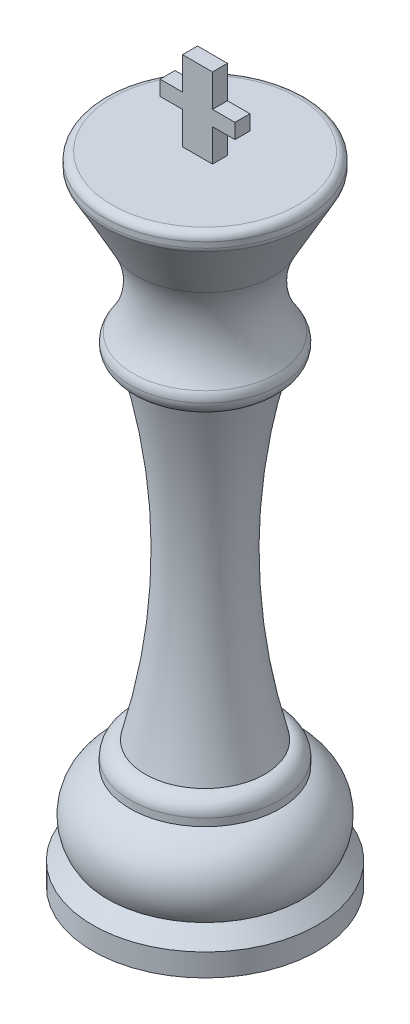
ISO-10303-21;
HEADER;
FILE_DESCRIPTION(('STEP AP214'),'2;1');
FILE_NAME('part.step','',(''),(''),'','','');
FILE_SCHEMA(('AUTOMOTIVE_DESIGN { 1 0 10303 214 1 1 1 1 }'));
ENDSEC;
DATA;
#1=APPLICATION_CONTEXT('core data for automotive mechanical design processes');
#2=APPLICATION_PROTOCOL_DEFINITION('international standard','automotive_design',2000,#1);
#3=PRODUCT_CONTEXT('',#1,'mechanical');
#4=PRODUCT('Part','Part','',(#3));
#5=PRODUCT_RELATED_PRODUCT_CATEGORY('part','',(#4));
#6=PRODUCT_DEFINITION_FORMATION('','',#4);
#7=PRODUCT_DEFINITION_CONTEXT('part definition',#1,'design');
#8=PRODUCT_DEFINITION('design','',#6,#7);
#9=PRODUCT_DEFINITION_SHAPE('','',#8);
#10=(LENGTH_UNIT() NAMED_UNIT(*) SI_UNIT(.MILLI.,.METRE.));
#11=(NAMED_UNIT(*) PLANE_ANGLE_UNIT() SI_UNIT($,.RADIAN.));
#12=(NAMED_UNIT(*) SI_UNIT($,.STERADIAN.) SOLID_ANGLE_UNIT());
#13=UNCERTAINTY_MEASURE_WITH_UNIT(LENGTH_MEASURE(1.E-05),#10,'distance_accuracy_value','');
#14=(GEOMETRIC_REPRESENTATION_CONTEXT(3) GLOBAL_UNCERTAINTY_ASSIGNED_CONTEXT((#13)) GLOBAL_UNIT_ASSIGNED_CONTEXT((#10,
#11,#12)) REPRESENTATION_CONTEXT('',''));
#15=CARTESIAN_POINT('',(0.,0.,0.));
#16=DIRECTION('',(0.,0.,1.));
#17=DIRECTION('',(1.,0.,0.));
#18=AXIS2_PLACEMENT_3D('',#15,#16,#17);
#19=CARTESIAN_POINT('',(0.,0.,0.));
#20=DIRECTION('',(0.,1.,0.));
#21=DIRECTION('',(0.,0.,1.));
#22=AXIS2_PLACEMENT_3D('',#19,#20,#21);
#23=PLANE('',#22);
#24=CARTESIAN_POINT('',(0.,0.,0.));
#25=DIRECTION('',(0.,-1.,0.));
#26=DIRECTION('',(0.,0.,-1.));
#27=AXIS2_PLACEMENT_3D('',#24,#25,#26);
#28=CIRCLE('',#27,15.);
#29=CARTESIAN_POINT('',(0.,0.,-15.));
#30=VERTEX_POINT('',#29);
#31=EDGE_CURVE('E205',#30,#30,#28,.T.);
#32=ORIENTED_EDGE('',*,*,#31,.T.);
#33=EDGE_LOOP('',(#32));
#34=FACE_BOUND('',#33,.T.);
#35=ADVANCED_FACE('F39',(#34),#23,.F.);
#36=CARTESIAN_POINT('',(0.,0.,0.));
#37=DIRECTION('',(0.,-1.,0.));
#38=DIRECTION('',(0.,0.,-1.));
#39=AXIS2_PLACEMENT_3D('',#36,#37,#38);
#40=CYLINDRICAL_SURFACE('',#39,15.);
#41=ORIENTED_EDGE('',*,*,#31,.F.);
#42=EDGE_LOOP('',(#41));
#43=FACE_BOUND('',#42,.T.);
#44=CARTESIAN_POINT('',(0.,3.,0.));
#45=DIRECTION('',(0.,-1.,0.));
#46=DIRECTION('',(0.,0.,-1.));
#47=AXIS2_PLACEMENT_3D('',#44,#45,#46);
#48=CIRCLE('',#47,15.);
#49=CARTESIAN_POINT('',(0.,3.,-15.));
#50=VERTEX_POINT('',#49);
#51=EDGE_CURVE('E201',#50,#50,#48,.T.);
#52=ORIENTED_EDGE('',*,*,#51,.T.);
#53=EDGE_LOOP('',(#52));
#54=FACE_BOUND('',#53,.T.);
#55=ADVANCED_FACE('F226',(#43,#54),#40,.T.);
#56=CARTESIAN_POINT('',(0.,5.,0.));
#57=DIRECTION('',(0.,-1.,0.));
#58=DIRECTION('',(0.,0.,-1.));
#59=AXIS2_PLACEMENT_3D('',#56,#57,#58);
#60=CONICAL_SURFACE('',#59,13.,0.785398163397448);
#61=ORIENTED_EDGE('',*,*,#51,.F.);
#62=EDGE_LOOP('',(#61));
#63=FACE_BOUND('',#62,.T.);
#64=CARTESIAN_POINT('',(0.,5.,0.));
#65=DIRECTION('',(0.,-1.,0.));
#66=DIRECTION('',(0.,0.,-1.));
#67=AXIS2_PLACEMENT_3D('',#64,#65,#66);
#68=CIRCLE('',#67,13.);
#69=CARTESIAN_POINT('',(0.,5.,-13.));
#70=VERTEX_POINT('',#69);
#71=EDGE_CURVE('E197',#70,#70,#68,.T.);
#72=ORIENTED_EDGE('',*,*,#71,.T.);
#73=EDGE_LOOP('',(#72));
#74=FACE_BOUND('',#73,.T.);
#75=ADVANCED_FACE('F231',(#63,#74),#60,.T.);
#76=CARTESIAN_POINT('',(0.,8.31380661428568,0.));
#77=DIRECTION('',(0.,-1.,0.));
#78=DIRECTION('',(0.,0.,-1.));
#79=AXIS2_PLACEMENT_3D('',#76,#77,#78);
#80=TOROIDAL_SURFACE('',#79,7.99813177671418,6.);
#81=ORIENTED_EDGE('',*,*,#71,.F.);
#82=EDGE_LOOP('',(#81));
#83=FACE_BOUND('',#82,.T.);
#84=CARTESIAN_POINT('',(0.,13.97,0.));
#85=DIRECTION('',(0.,-1.,0.));
#86=DIRECTION('',(0.,0.,-1.));
#87=AXIS2_PLACEMENT_3D('',#84,#85,#86);
#88=CIRCLE('',#87,10.);
#89=CARTESIAN_POINT('',(0.,13.97,-10.));
#90=VERTEX_POINT('',#89);
#91=EDGE_CURVE('E193',#90,#90,#88,.T.);
#92=ORIENTED_EDGE('',*,*,#91,.T.);
#93=EDGE_LOOP('',(#92));
#94=FACE_BOUND('',#93,.T.);
#95=ADVANCED_FACE('F237',(#83,#94),#80,.T.);
#96=CARTESIAN_POINT('',(0.,0.,0.));
#97=DIRECTION('',(0.,-1.,0.));
#98=DIRECTION('',(0.,0.,-1.));
#99=AXIS2_PLACEMENT_3D('',#96,#97,#98);
#100=CYLINDRICAL_SURFACE('',#99,10.);
#101=ORIENTED_EDGE('',*,*,#91,.F.);
#102=EDGE_LOOP('',(#101));
#103=FACE_BOUND('',#102,.T.);
#104=CARTESIAN_POINT('',(0.,14.97,0.));
#105=DIRECTION('',(0.,-1.,0.));
#106=DIRECTION('',(0.,0.,-1.));
#107=AXIS2_PLACEMENT_3D('',#104,#105,#106);
#108=CIRCLE('',#107,10.);
#109=CARTESIAN_POINT('',(0.,14.97,-10.));
#110=VERTEX_POINT('',#109);
#111=EDGE_CURVE('E189',#110,#110,#108,.T.);
#112=ORIENTED_EDGE('',*,*,#111,.T.);
#113=EDGE_LOOP('',(#112));
#114=FACE_BOUND('',#113,.T.);
#115=ADVANCED_FACE('F241',(#103,#114),#100,.T.);
#116=CARTESIAN_POINT('',(0.,14.97,0.));
#117=DIRECTION('',(0.,-1.,0.));
#118=DIRECTION('',(0.,0.,-1.));
#119=AXIS2_PLACEMENT_3D('',#116,#117,#118);
#120=TOROIDAL_SURFACE('',#119,8.,2.);
#121=ORIENTED_EDGE('',*,*,#111,.F.);
#122=EDGE_LOOP('',(#121));
#123=FACE_BOUND('',#122,.T.);
#124=CARTESIAN_POINT('',(0.,16.97,0.));
#125=DIRECTION('',(0.,-1.,0.));
#126=DIRECTION('',(0.,0.,-1.));
#127=AXIS2_PLACEMENT_3D('',#124,#125,#126);
#128=CIRCLE('',#127,8.);
#129=CARTESIAN_POINT('',(0.,16.97,-8.));
#130=VERTEX_POINT('',#129);
#131=EDGE_CURVE('E185',#130,#130,#128,.T.);
#132=ORIENTED_EDGE('',*,*,#131,.T.);
#133=EDGE_LOOP('',(#132));
#134=FACE_BOUND('',#133,.T.);
#135=ADVANCED_FACE('F245',(#123,#134),#120,.T.);
#136=CARTESIAN_POINT('',(0.,38.98,0.));
#137=DIRECTION('',(0.,-1.,0.));
#138=DIRECTION('',(0.,0.,-1.));
#139=AXIS2_PLACEMENT_3D('',#136,#137,#138);
#140=TOROIDAL_SURFACE('',#139,90.1009129060085,85.);
#141=ORIENTED_EDGE('',*,*,#131,.F.);
#142=EDGE_LOOP('',(#141));
#143=FACE_BOUND('',#142,.T.);
#144=CARTESIAN_POINT('',(0.,60.99,0.));
#145=DIRECTION('',(0.,-1.,0.));
#146=DIRECTION('',(0.,0.,-1.));
#147=AXIS2_PLACEMENT_3D('',#144,#145,#146);
#148=CIRCLE('',#147,8.00000000000001);
#149=CARTESIAN_POINT('',(0.,60.99,-8.00000000000001));
#150=VERTEX_POINT('',#149);
#151=EDGE_CURVE('E181',#150,#150,#148,.T.);
#152=ORIENTED_EDGE('',*,*,#151,.T.);
#153=EDGE_LOOP('',(#152));
#154=FACE_BOUND('',#153,.T.);
#155=ADVANCED_FACE('F249',(#143,#154),#140,.F.);
#156=CARTESIAN_POINT('',(0.,62.99,0.));
#157=DIRECTION('',(0.,-1.,0.));
#158=DIRECTION('',(0.,0.,-1.));
#159=AXIS2_PLACEMENT_3D('',#156,#157,#158);
#160=TOROIDAL_SURFACE('',#159,8.00000000000001,2.);
#161=ORIENTED_EDGE('',*,*,#151,.F.);
#162=EDGE_LOOP('',(#161));
#163=FACE_BOUND('',#162,.T.);
#164=CARTESIAN_POINT('',(0.,62.99,0.));
#165=DIRECTION('',(0.,-1.,0.));
#166=DIRECTION('',(0.,0.,-1.));
#167=AXIS2_PLACEMENT_3D('',#164,#165,#166);
#168=CIRCLE('',#167,10.);
#169=CARTESIAN_POINT('',(0.,62.99,-10.));
#170=VERTEX_POINT('',#169);
#171=EDGE_CURVE('E177',#170,#170,#168,.T.);
#172=ORIENTED_EDGE('',*,*,#171,.T.);
#173=EDGE_LOOP('',(#172));
#174=FACE_BOUND('',#173,.T.);
#175=ADVANCED_FACE('F253',(#163,#174),#160,.T.);
#176=CARTESIAN_POINT('',(0.,62.99,0.));
#177=DIRECTION('',(0.,-1.,0.));
#178=DIRECTION('',(0.,0.,-1.));
#179=AXIS2_PLACEMENT_3D('',#176,#177,#178);
#180=TOROIDAL_SURFACE('',#179,8.0183666666667,1.98163333333331);
#181=ORIENTED_EDGE('',*,*,#171,.F.);
#182=EDGE_LOOP('',(#181));
#183=FACE_BOUND('',#182,.T.);
#184=CARTESIAN_POINT('',(0.,64.15,0.));
#185=DIRECTION('',(0.,-1.,0.));
#186=DIRECTION('',(0.,0.,-1.));
#187=AXIS2_PLACEMENT_3D('',#184,#185,#186);
#188=CIRCLE('',#187,9.625);
#189=CARTESIAN_POINT('',(0.,64.15,-9.625));
#190=VERTEX_POINT('',#189);
#191=EDGE_CURVE('E173',#190,#190,#188,.T.);
#192=ORIENTED_EDGE('',*,*,#191,.T.);
#193=EDGE_LOOP('',(#192));
#194=FACE_BOUND('',#193,.T.);
#195=ADVANCED_FACE('F257',(#183,#194),#180,.T.);
#196=CARTESIAN_POINT('',(0.,70.0974171138287,0.));
#197=DIRECTION('',(0.,-1.,0.));
#198=DIRECTION('',(0.,0.,-1.));
#199=AXIS2_PLACEMENT_3D('',#196,#197,#198);
#200=TOROIDAL_SURFACE('',#199,17.8623436054433,10.16);
#201=ORIENTED_EDGE('',*,*,#191,.F.);
#202=EDGE_LOOP('',(#201));
#203=FACE_BOUND('',#202,.T.);
#204=CARTESIAN_POINT('',(0.,75.0657635006116,0.));
#205=DIRECTION('',(0.,-1.,0.));
#206=DIRECTION('',(0.,0.,-1.));
#207=AXIS2_PLACEMENT_3D('',#204,#205,#206);
#208=CIRCLE('',#207,9.00000000000001);
#209=CARTESIAN_POINT('',(0.,75.0657635006116,-9.00000000000001));
#210=VERTEX_POINT('',#209);
#211=EDGE_CURVE('E169',#210,#210,#208,.T.);
#212=ORIENTED_EDGE('',*,*,#211,.T.);
#213=EDGE_LOOP('',(#212));
#214=FACE_BOUND('',#213,.T.);
#215=ADVANCED_FACE('F261',(#203,#214),#200,.F.);
#216=CARTESIAN_POINT('',(0.,82.8397501905373,0.));
#217=DIRECTION('',(0.,1.,0.));
#218=DIRECTION('',(0.,0.,1.));
#219=AXIS2_PLACEMENT_3D('',#216,#217,#218);
#220=CONICAL_SURFACE('',#219,13.3038716011996,0.505621884302758);
#221=ORIENTED_EDGE('',*,*,#211,.F.);
#222=EDGE_LOOP('',(#221));
#223=FACE_BOUND('',#222,.T.);
#224=CARTESIAN_POINT('',(0.,82.8397501905373,0.));
#225=DIRECTION('',(0.,-1.,0.));
#226=DIRECTION('',(0.,0.,-1.));
#227=AXIS2_PLACEMENT_3D('',#224,#225,#226);
#228=CIRCLE('',#227,13.3038716011996);
#229=CARTESIAN_POINT('',(0.,82.8397501905373,-13.3038716011996));
#230=VERTEX_POINT('',#229);
#231=EDGE_CURVE('E160',#230,#230,#228,.T.);
#232=ORIENTED_EDGE('',*,*,#231,.T.);
#233=EDGE_LOOP('',(#232));
#234=FACE_BOUND('',#233,.T.);
#235=ADVANCED_FACE('F265',(#223,#234),#220,.T.);
#236=CARTESIAN_POINT('',(0.,83.3241017945401,0.));
#237=DIRECTION('',(0.,-1.,0.));
#238=DIRECTION('',(0.,0.,-1.));
#239=AXIS2_PLACEMENT_3D('',#236,#237,#238);
#240=TOROIDAL_SURFACE('',#239,12.4289981682393,0.999999999999999);
#241=ORIENTED_EDGE('',*,*,#231,.F.);
#242=EDGE_LOOP('',(#241));
#243=FACE_BOUND('',#242,.T.);
#244=CARTESIAN_POINT('',(0.,83.3241017945401,0.));
#245=DIRECTION('',(0.,-1.,0.));
#246=DIRECTION('',(0.,0.,-1.));
#247=AXIS2_PLACEMENT_3D('',#244,#245,#246);
#248=CIRCLE('',#247,13.4289981682393);
#249=CARTESIAN_POINT('',(0.,83.3241017945401,-13.4289981682393));
#250=VERTEX_POINT('',#249);
#251=EDGE_CURVE('E155',#250,#250,#248,.T.);
#252=ORIENTED_EDGE('',*,*,#251,.T.);
#253=EDGE_LOOP('',(#252));
#254=FACE_BOUND('',#253,.T.);
#255=ADVANCED_FACE('F269',(#243,#254),#240,.T.);
#256=CARTESIAN_POINT('',(0.,0.,0.));
#257=DIRECTION('',(0.,-1.,0.));
#258=DIRECTION('',(0.,0.,-1.));
#259=AXIS2_PLACEMENT_3D('',#256,#257,#258);
#260=CYLINDRICAL_SURFACE('',#259,13.4289981682393);
#261=CARTESIAN_POINT('',(0.,84.0657635006117,0.));
#262=DIRECTION('',(0.,-1.,0.));
#263=DIRECTION('',(0.,0.,-1.));
#264=AXIS2_PLACEMENT_3D('',#261,#262,#263);
#265=CIRCLE('',#264,13.4289981682393);
#266=CARTESIAN_POINT('',(0.,84.0657635006117,-13.4289981682393));
#267=VERTEX_POINT('',#266);
#268=EDGE_CURVE('E48',#267,#267,#265,.T.);
#269=ORIENTED_EDGE('',*,*,#268,.T.);
#270=EDGE_LOOP('',(#269));
#271=FACE_BOUND('',#270,.T.);
#272=ORIENTED_EDGE('',*,*,#251,.F.);
#273=EDGE_LOOP('',(#272));
#274=FACE_BOUND('',#273,.T.);
#275=ADVANCED_FACE('F212',(#271,#274),#260,.T.);
#276=CARTESIAN_POINT('',(-13.4289981682393,85.0657635006117,0.));
#277=DIRECTION('',(0.,-1.,0.));
#278=DIRECTION('',(0.,0.,-1.));
#279=AXIS2_PLACEMENT_3D('',#276,#277,#278);
#280=PLANE('',#279);
#281=DIRECTION('',(0.,0.,-1.));
#282=VECTOR('',#281,1.);
#283=CARTESIAN_POINT('',(1.99100183176075,85.0657635006117,1.));
#284=LINE('',#283,#282);
#285=CARTESIAN_POINT('',(1.99100183176075,85.0657635006117,1.));
#286=VERTEX_POINT('',#285);
#287=CARTESIAN_POINT('',(1.99100183176075,85.0657635006117,-1.));
#288=VERTEX_POINT('',#287);
#289=EDGE_CURVE('E60',#286,#288,#284,.T.);
#290=ORIENTED_EDGE('',*,*,#289,.F.);
#291=DIRECTION('',(1.,0.,0.));
#292=VECTOR('',#291,1.);
#293=CARTESIAN_POINT('',(-2.00899816823925,85.0657635006117,1.));
#294=LINE('',#293,#292);
#295=CARTESIAN_POINT('',(-2.00899816823925,85.0657635006117,1.));
#296=VERTEX_POINT('',#295);
#297=EDGE_CURVE('E55',#296,#286,#294,.T.);
#298=ORIENTED_EDGE('',*,*,#297,.F.);
#299=DIRECTION('',(0.,0.,-1.));
#300=VECTOR('',#299,1.);
#301=CARTESIAN_POINT('',(-2.00899816823925,85.0657635006117,1.));
#302=LINE('',#301,#300);
#303=CARTESIAN_POINT('',(-2.00899816823925,85.0657635006117,-1.));
#304=VERTEX_POINT('',#303);
#305=EDGE_CURVE('E541',#296,#304,#302,.T.);
#306=ORIENTED_EDGE('',*,*,#305,.T.);
#307=DIRECTION('',(1.,0.,0.));
#308=VECTOR('',#307,1.);
#309=CARTESIAN_POINT('',(-2.00899816823925,85.0657635006117,-1.));
#310=LINE('',#309,#308);
#311=EDGE_CURVE('E510',#304,#288,#310,.T.);
#312=ORIENTED_EDGE('',*,*,#311,.T.);
#313=EDGE_LOOP('',(#290,#298,#306,#312));
#314=FACE_BOUND('',#313,.T.);
#315=CARTESIAN_POINT('',(0.,85.0657635006117,0.));
#316=DIRECTION('',(0.,-1.,0.));
#317=DIRECTION('',(0.,0.,-1.));
#318=AXIS2_PLACEMENT_3D('',#315,#316,#317);
#319=CIRCLE('',#318,12.4289981682393);
#320=CARTESIAN_POINT('',(0.,85.0657635006117,-12.4289981682393));
#321=VERTEX_POINT('',#320);
#322=EDGE_CURVE('E11',#321,#321,#319,.F.);
#323=ORIENTED_EDGE('',*,*,#322,.T.);
#324=EDGE_LOOP('',(#323));
#325=FACE_BOUND('',#324,.T.);
#326=ADVANCED_FACE('F216',(#314,#325),#280,.F.);
#327=CARTESIAN_POINT('',(0.,84.0657635006117,0.));
#328=DIRECTION('',(0.,-1.,0.));
#329=DIRECTION('',(0.,0.,-1.));
#330=AXIS2_PLACEMENT_3D('',#327,#328,#329);
#331=TOROIDAL_SURFACE('',#330,12.4289981682393,1.);
#332=ORIENTED_EDGE('',*,*,#322,.F.);
#333=EDGE_LOOP('',(#332));
#334=FACE_BOUND('',#333,.T.);
#335=ORIENTED_EDGE('',*,*,#268,.F.);
#336=EDGE_LOOP('',(#335));
#337=FACE_BOUND('',#336,.T.);
#338=ADVANCED_FACE('F41',(#334,#337),#331,.T.);
#339=CARTESIAN_POINT('',(1.99100183176075,91.4020353946953,1.));
#340=DIRECTION('',(-1.,0.,0.));
#341=DIRECTION('',(0.,0.,1.));
#342=AXIS2_PLACEMENT_3D('',#339,#340,#341);
#343=PLANE('',#342);
#344=DIRECTION('',(0.,1.,0.));
#345=VECTOR('',#344,1.);
#346=CARTESIAN_POINT('',(1.99100183176075,91.4020353946953,-1.));
#347=LINE('',#346,#345);
#348=CARTESIAN_POINT('',(1.99100183176075,91.4020353946953,-1.));
#349=VERTEX_POINT('',#348);
#350=CARTESIAN_POINT('',(1.99100183176075,95.7383072887789,-1.));
#351=VERTEX_POINT('',#350);
#352=EDGE_CURVE('E153',#349,#351,#347,.T.);
#353=ORIENTED_EDGE('',*,*,#352,.T.);
#354=DIRECTION('',(0.,0.,-1.));
#355=VECTOR('',#354,1.);
#356=CARTESIAN_POINT('',(1.99100183176075,95.7383072887789,1.));
#357=LINE('',#356,#355);
#358=CARTESIAN_POINT('',(1.99100183176075,95.7383072887789,1.));
#359=VERTEX_POINT('',#358);
#360=EDGE_CURVE('E131',#359,#351,#357,.T.);
#361=ORIENTED_EDGE('',*,*,#360,.F.);
#362=DIRECTION('',(0.,1.,0.));
#363=VECTOR('',#362,1.);
#364=CARTESIAN_POINT('',(1.99100183176075,91.4020353946953,1.));
#365=LINE('',#364,#363);
#366=CARTESIAN_POINT('',(1.99100183176075,91.4020353946953,1.));
#367=VERTEX_POINT('',#366);
#368=EDGE_CURVE('E139',#367,#359,#365,.T.);
#369=ORIENTED_EDGE('',*,*,#368,.F.);
#370=DIRECTION('',(0.,0.,-1.));
#371=VECTOR('',#370,1.);
#372=CARTESIAN_POINT('',(1.99100183176075,91.4020353946953,1.));
#373=LINE('',#372,#371);
#374=EDGE_CURVE('E524',#367,#349,#373,.T.);
#375=ORIENTED_EDGE('',*,*,#374,.T.);
#376=EDGE_LOOP('',(#353,#361,#369,#375));
#377=FACE_BOUND('',#376,.T.);
#378=ADVANCED_FACE('F151',(#377),#343,.F.);
#379=CARTESIAN_POINT('',(1.99100183176075,95.7383072887789,1.));
#380=DIRECTION('',(0.,-1.,0.));
#381=DIRECTION('',(0.,0.,-1.));
#382=AXIS2_PLACEMENT_3D('',#379,#380,#381);
#383=PLANE('',#382);
#384=DIRECTION('',(-1.,0.,0.));
#385=VECTOR('',#384,1.);
#386=CARTESIAN_POINT('',(1.99100183176075,95.7383072887789,-1.));
#387=LINE('',#386,#385);
#388=CARTESIAN_POINT('',(-2.00899816823925,95.7383072887789,-1.));
#389=VERTEX_POINT('',#388);
#390=EDGE_CURVE('E486',#351,#389,#387,.T.);
#391=ORIENTED_EDGE('',*,*,#390,.T.);
#392=DIRECTION('',(0.,0.,-1.));
#393=VECTOR('',#392,1.);
#394=CARTESIAN_POINT('',(-2.00899816823925,95.7383072887789,1.));
#395=LINE('',#394,#393);
#396=CARTESIAN_POINT('',(-2.00899816823925,95.7383072887789,1.));
#397=VERTEX_POINT('',#396);
#398=EDGE_CURVE('E134',#397,#389,#395,.T.);
#399=ORIENTED_EDGE('',*,*,#398,.F.);
#400=DIRECTION('',(-1.,0.,0.));
#401=VECTOR('',#400,1.);
#402=CARTESIAN_POINT('',(1.99100183176075,95.7383072887789,1.));
#403=LINE('',#402,#401);
#404=EDGE_CURVE('E127',#359,#397,#403,.T.);
#405=ORIENTED_EDGE('',*,*,#404,.F.);
#406=ORIENTED_EDGE('',*,*,#360,.T.);
#407=EDGE_LOOP('',(#391,#399,#405,#406));
#408=FACE_BOUND('',#407,.T.);
#409=ADVANCED_FACE('F129',(#408),#383,.F.);
#410=CARTESIAN_POINT('',(-2.00899816823925,95.7383072887789,1.));
#411=DIRECTION('',(1.,0.,0.));
#412=DIRECTION('',(0.,1.,0.));
#413=AXIS2_PLACEMENT_3D('',#410,#411,#412);
#414=PLANE('',#413);
#415=DIRECTION('',(0.,-1.,0.));
#416=VECTOR('',#415,1.);
#417=CARTESIAN_POINT('',(-2.00899816823925,95.7383072887789,-1.));
#418=LINE('',#417,#416);
#419=CARTESIAN_POINT('',(-2.00899816823925,91.4020353946953,-1.));
#420=VERTEX_POINT('',#419);
#421=EDGE_CURVE('E490',#389,#420,#418,.T.);
#422=ORIENTED_EDGE('',*,*,#421,.T.);
#423=DIRECTION('',(0.,0.,-1.));
#424=VECTOR('',#423,1.);
#425=CARTESIAN_POINT('',(-2.00899816823925,91.4020353946953,1.));
#426=LINE('',#425,#424);
#427=CARTESIAN_POINT('',(-2.00899816823925,91.4020353946953,1.));
#428=VERTEX_POINT('',#427);
#429=EDGE_CURVE('E162',#428,#420,#426,.T.);
#430=ORIENTED_EDGE('',*,*,#429,.F.);
#431=DIRECTION('',(0.,-1.,0.));
#432=VECTOR('',#431,1.);
#433=CARTESIAN_POINT('',(-2.00899816823925,95.7383072887789,1.));
#434=LINE('',#433,#432);
#435=EDGE_CURVE('E138',#397,#428,#434,.T.);
#436=ORIENTED_EDGE('',*,*,#435,.F.);
#437=ORIENTED_EDGE('',*,*,#398,.T.);
#438=EDGE_LOOP('',(#422,#430,#436,#437));
#439=FACE_BOUND('',#438,.T.);
#440=ADVANCED_FACE('F278',(#439),#414,.F.);
#441=CARTESIAN_POINT('',(-2.00899816823925,91.4020353946953,1.));
#442=DIRECTION('',(0.,-1.,0.));
#443=DIRECTION('',(0.,0.,-1.));
#444=AXIS2_PLACEMENT_3D('',#441,#442,#443);
#445=PLANE('',#444);
#446=DIRECTION('',(-1.,0.,0.));
#447=VECTOR('',#446,1.);
#448=CARTESIAN_POINT('',(-2.00899816823925,91.4020353946953,-1.));
#449=LINE('',#448,#447);
#450=CARTESIAN_POINT('',(-5.00899816823925,91.4020353946953,-1.));
#451=VERTEX_POINT('',#450);
#452=EDGE_CURVE('E497',#420,#451,#449,.T.);
#453=ORIENTED_EDGE('',*,*,#452,.T.);
#454=DIRECTION('',(0.,0.,-1.));
#455=VECTOR('',#454,1.);
#456=CARTESIAN_POINT('',(-5.00899816823925,91.4020353946953,1.));
#457=LINE('',#456,#455);
#458=CARTESIAN_POINT('',(-5.00899816823925,91.4020353946953,1.));
#459=VERTEX_POINT('',#458);
#460=EDGE_CURVE('E552',#459,#451,#457,.T.);
#461=ORIENTED_EDGE('',*,*,#460,.F.);
#462=DIRECTION('',(-1.,0.,0.));
#463=VECTOR('',#462,1.);
#464=CARTESIAN_POINT('',(-2.00899816823925,91.4020353946953,1.));
#465=LINE('',#464,#463);
#466=EDGE_CURVE('E561',#428,#459,#465,.T.);
#467=ORIENTED_EDGE('',*,*,#466,.F.);
#468=ORIENTED_EDGE('',*,*,#429,.T.);
#469=EDGE_LOOP('',(#453,#461,#467,#468));
#470=FACE_BOUND('',#469,.T.);
#471=ADVANCED_FACE('F281',(#470),#445,.F.);
#472=CARTESIAN_POINT('',(-5.00899816823925,91.4020353946953,1.));
#473=DIRECTION('',(1.,0.,0.));
#474=DIRECTION('',(0.,0.,-1.));
#475=AXIS2_PLACEMENT_3D('',#472,#473,#474);
#476=PLANE('',#475);
#477=DIRECTION('',(0.,-1.,0.));
#478=VECTOR('',#477,1.);
#479=CARTESIAN_POINT('',(-5.00899816823925,91.4020353946953,-1.));
#480=LINE('',#479,#478);
#481=CARTESIAN_POINT('',(-5.00899816823925,89.4020353946953,-1.));
#482=VERTEX_POINT('',#481);
#483=EDGE_CURVE('E500',#451,#482,#480,.T.);
#484=ORIENTED_EDGE('',*,*,#483,.T.);
#485=DIRECTION('',(0.,0.,-1.));
#486=VECTOR('',#485,1.);
#487=CARTESIAN_POINT('',(-5.00899816823925,89.4020353946953,1.));
#488=LINE('',#487,#486);
#489=CARTESIAN_POINT('',(-5.00899816823925,89.4020353946953,1.));
#490=VERTEX_POINT('',#489);
#491=EDGE_CURVE('E548',#490,#482,#488,.T.);
#492=ORIENTED_EDGE('',*,*,#491,.F.);
#493=DIRECTION('',(0.,-1.,0.));
#494=VECTOR('',#493,1.);
#495=CARTESIAN_POINT('',(-5.00899816823925,91.4020353946953,1.));
#496=LINE('',#495,#494);
#497=EDGE_CURVE('E573',#459,#490,#496,.T.);
#498=ORIENTED_EDGE('',*,*,#497,.F.);
#499=ORIENTED_EDGE('',*,*,#460,.T.);
#500=EDGE_LOOP('',(#484,#492,#498,#499));
#501=FACE_BOUND('',#500,.T.);
#502=ADVANCED_FACE('F285',(#501),#476,.F.);
#503=CARTESIAN_POINT('',(-5.00899816823925,89.4020353946953,1.));
#504=DIRECTION('',(0.,1.,0.));
#505=DIRECTION('',(0.,0.,1.));
#506=AXIS2_PLACEMENT_3D('',#503,#504,#505);
#507=PLANE('',#506);
#508=DIRECTION('',(1.,0.,0.));
#509=VECTOR('',#508,1.);
#510=CARTESIAN_POINT('',(-5.00899816823925,89.4020353946953,-1.));
#511=LINE('',#510,#509);
#512=CARTESIAN_POINT('',(-2.00899816823925,89.4020353946953,-1.));
#513=VERTEX_POINT('',#512);
#514=EDGE_CURVE('E503',#482,#513,#511,.T.);
#515=ORIENTED_EDGE('',*,*,#514,.T.);
#516=DIRECTION('',(0.,0.,-1.));
#517=VECTOR('',#516,1.);
#518=CARTESIAN_POINT('',(-2.00899816823925,89.4020353946953,1.));
#519=LINE('',#518,#517);
#520=CARTESIAN_POINT('',(-2.00899816823925,89.4020353946953,1.));
#521=VERTEX_POINT('',#520);
#522=EDGE_CURVE('E544',#521,#513,#519,.T.);
#523=ORIENTED_EDGE('',*,*,#522,.F.);
#524=DIRECTION('',(1.,0.,0.));
#525=VECTOR('',#524,1.);
#526=CARTESIAN_POINT('',(-5.00899816823925,89.4020353946953,1.));
#527=LINE('',#526,#525);
#528=EDGE_CURVE('E569',#490,#521,#527,.T.);
#529=ORIENTED_EDGE('',*,*,#528,.F.);
#530=ORIENTED_EDGE('',*,*,#491,.T.);
#531=EDGE_LOOP('',(#515,#523,#529,#530));
#532=FACE_BOUND('',#531,.T.);
#533=ADVANCED_FACE('F289',(#532),#507,.F.);
#534=CARTESIAN_POINT('',(-2.00899816823925,89.4020353946953,1.));
#535=DIRECTION('',(1.,0.,0.));
#536=DIRECTION('',(0.,1.,0.));
#537=AXIS2_PLACEMENT_3D('',#534,#535,#536);
#538=PLANE('',#537);
#539=DIRECTION('',(0.,-1.,0.));
#540=VECTOR('',#539,1.);
#541=CARTESIAN_POINT('',(-2.00899816823925,89.4020353946953,-1.));
#542=LINE('',#541,#540);
#543=EDGE_CURVE('E506',#513,#304,#542,.T.);
#544=ORIENTED_EDGE('',*,*,#543,.T.);
#545=ORIENTED_EDGE('',*,*,#305,.F.);
#546=DIRECTION('',(0.,-1.,0.));
#547=VECTOR('',#546,1.);
#548=CARTESIAN_POINT('',(-2.00899816823925,89.4020353946953,1.));
#549=LINE('',#548,#547);
#550=EDGE_CURVE('E572',#521,#296,#549,.T.);
#551=ORIENTED_EDGE('',*,*,#550,.F.);
#552=ORIENTED_EDGE('',*,*,#522,.T.);
#553=EDGE_LOOP('',(#544,#545,#551,#552));
#554=FACE_BOUND('',#553,.T.);
#555=ADVANCED_FACE('F293',(#554),#538,.F.);
#556=CARTESIAN_POINT('',(1.99100183176075,85.0657635006117,1.));
#557=DIRECTION('',(-1.,0.,0.));
#558=DIRECTION('',(0.,0.,1.));
#559=AXIS2_PLACEMENT_3D('',#556,#557,#558);
#560=PLANE('',#559);
#561=DIRECTION('',(0.,1.,0.));
#562=VECTOR('',#561,1.);
#563=CARTESIAN_POINT('',(1.99100183176075,85.0657635006117,-1.));
#564=LINE('',#563,#562);
#565=CARTESIAN_POINT('',(1.99100183176075,89.4020353946953,-1.));
#566=VERTEX_POINT('',#565);
#567=EDGE_CURVE('E513',#288,#566,#564,.T.);
#568=ORIENTED_EDGE('',*,*,#567,.T.);
#569=DIRECTION('',(0.,0.,-1.));
#570=VECTOR('',#569,1.);
#571=CARTESIAN_POINT('',(1.99100183176075,89.4020353946953,1.));
#572=LINE('',#571,#570);
#573=CARTESIAN_POINT('',(1.99100183176075,89.4020353946953,1.));
#574=VERTEX_POINT('',#573);
#575=EDGE_CURVE('E535',#574,#566,#572,.T.);
#576=ORIENTED_EDGE('',*,*,#575,.F.);
#577=DIRECTION('',(0.,1.,0.));
#578=VECTOR('',#577,1.);
#579=CARTESIAN_POINT('',(1.99100183176075,85.0657635006117,1.));
#580=LINE('',#579,#578);
#581=EDGE_CURVE('E583',#286,#574,#580,.T.);
#582=ORIENTED_EDGE('',*,*,#581,.F.);
#583=ORIENTED_EDGE('',*,*,#289,.T.);
#584=EDGE_LOOP('',(#568,#576,#582,#583));
#585=FACE_BOUND('',#584,.T.);
#586=ADVANCED_FACE('F297',(#585),#560,.F.);
#587=CARTESIAN_POINT('',(1.99100183176075,89.4020353946953,1.));
#588=DIRECTION('',(0.,1.,0.));
#589=DIRECTION('',(0.,0.,1.));
#590=AXIS2_PLACEMENT_3D('',#587,#588,#589);
#591=PLANE('',#590);
#592=DIRECTION('',(1.,0.,0.));
#593=VECTOR('',#592,1.);
#594=CARTESIAN_POINT('',(1.99100183176075,89.4020353946953,-1.));
#595=LINE('',#594,#593);
#596=CARTESIAN_POINT('',(4.99100183176075,89.4020353946953,-1.));
#597=VERTEX_POINT('',#596);
#598=EDGE_CURVE('E516',#566,#597,#595,.T.);
#599=ORIENTED_EDGE('',*,*,#598,.T.);
#600=DIRECTION('',(0.,0.,-1.));
#601=VECTOR('',#600,1.);
#602=CARTESIAN_POINT('',(4.99100183176075,89.4020353946953,1.));
#603=LINE('',#602,#601);
#604=CARTESIAN_POINT('',(4.99100183176075,89.4020353946953,1.));
#605=VERTEX_POINT('',#604);
#606=EDGE_CURVE('E531',#605,#597,#603,.T.);
#607=ORIENTED_EDGE('',*,*,#606,.F.);
#608=DIRECTION('',(1.,0.,0.));
#609=VECTOR('',#608,1.);
#610=CARTESIAN_POINT('',(1.99100183176075,89.4020353946953,1.));
#611=LINE('',#610,#609);
#612=EDGE_CURVE('E586',#574,#605,#611,.T.);
#613=ORIENTED_EDGE('',*,*,#612,.F.);
#614=ORIENTED_EDGE('',*,*,#575,.T.);
#615=EDGE_LOOP('',(#599,#607,#613,#614));
#616=FACE_BOUND('',#615,.T.);
#617=ADVANCED_FACE('F301',(#616),#591,.F.);
#618=CARTESIAN_POINT('',(4.99100183176075,89.4020353946953,1.));
#619=DIRECTION('',(-1.,0.,0.));
#620=DIRECTION('',(0.,0.,1.));
#621=AXIS2_PLACEMENT_3D('',#618,#619,#620);
#622=PLANE('',#621);
#623=DIRECTION('',(0.,1.,0.));
#624=VECTOR('',#623,1.);
#625=CARTESIAN_POINT('',(4.99100183176075,89.4020353946953,-1.));
#626=LINE('',#625,#624);
#627=CARTESIAN_POINT('',(4.99100183176075,91.4020353946953,-1.));
#628=VERTEX_POINT('',#627);
#629=EDGE_CURVE('E519',#597,#628,#626,.T.);
#630=ORIENTED_EDGE('',*,*,#629,.T.);
#631=DIRECTION('',(0.,0.,-1.));
#632=VECTOR('',#631,1.);
#633=CARTESIAN_POINT('',(4.99100183176075,91.4020353946953,1.));
#634=LINE('',#633,#632);
#635=CARTESIAN_POINT('',(4.99100183176075,91.4020353946953,1.));
#636=VERTEX_POINT('',#635);
#637=EDGE_CURVE('E527',#636,#628,#634,.T.);
#638=ORIENTED_EDGE('',*,*,#637,.F.);
#639=DIRECTION('',(0.,1.,0.));
#640=VECTOR('',#639,1.);
#641=CARTESIAN_POINT('',(4.99100183176075,89.4020353946953,1.));
#642=LINE('',#641,#640);
#643=EDGE_CURVE('E588',#605,#636,#642,.T.);
#644=ORIENTED_EDGE('',*,*,#643,.F.);
#645=ORIENTED_EDGE('',*,*,#606,.T.);
#646=EDGE_LOOP('',(#630,#638,#644,#645));
#647=FACE_BOUND('',#646,.T.);
#648=ADVANCED_FACE('F305',(#647),#622,.F.);
#649=CARTESIAN_POINT('',(4.99100183176075,91.4020353946953,1.));
#650=DIRECTION('',(0.,-1.,0.));
#651=DIRECTION('',(0.,0.,-1.));
#652=AXIS2_PLACEMENT_3D('',#649,#650,#651);
#653=PLANE('',#652);
#654=DIRECTION('',(-1.,0.,0.));
#655=VECTOR('',#654,1.);
#656=CARTESIAN_POINT('',(4.99100183176075,91.4020353946953,-1.));
#657=LINE('',#656,#655);
#658=EDGE_CURVE('E149',#628,#349,#657,.T.);
#659=ORIENTED_EDGE('',*,*,#658,.T.);
#660=ORIENTED_EDGE('',*,*,#374,.F.);
#661=DIRECTION('',(-1.,0.,0.));
#662=VECTOR('',#661,1.);
#663=CARTESIAN_POINT('',(4.99100183176075,91.4020353946953,1.));
#664=LINE('',#663,#662);
#665=EDGE_CURVE('E144',#636,#367,#664,.T.);
#666=ORIENTED_EDGE('',*,*,#665,.F.);
#667=ORIENTED_EDGE('',*,*,#637,.T.);
#668=EDGE_LOOP('',(#659,#660,#666,#667));
#669=FACE_BOUND('',#668,.T.);
#670=ADVANCED_FACE('F309',(#669),#653,.F.);
#671=CARTESIAN_POINT('',(0.,0.,1.));
#672=DIRECTION('',(0.,0.,1.));
#673=DIRECTION('',(1.,0.,0.));
#674=AXIS2_PLACEMENT_3D('',#671,#672,#673);
#675=PLANE('',#674);
#676=ORIENTED_EDGE('',*,*,#368,.T.);
#677=ORIENTED_EDGE('',*,*,#404,.T.);
#678=ORIENTED_EDGE('',*,*,#435,.T.);
#679=ORIENTED_EDGE('',*,*,#466,.T.);
#680=ORIENTED_EDGE('',*,*,#497,.T.);
#681=ORIENTED_EDGE('',*,*,#528,.T.);
#682=ORIENTED_EDGE('',*,*,#550,.T.);
#683=ORIENTED_EDGE('',*,*,#297,.T.);
#684=ORIENTED_EDGE('',*,*,#581,.T.);
#685=ORIENTED_EDGE('',*,*,#612,.T.);
#686=ORIENTED_EDGE('',*,*,#643,.T.);
#687=ORIENTED_EDGE('',*,*,#665,.T.);
#688=EDGE_LOOP('',(#676,#677,#678,#679,#680,#681,#682,#683,#684,#685,#686,#687));
#689=FACE_BOUND('',#688,.T.);
#690=ADVANCED_FACE('F142',(#689),#675,.T.);
#691=CARTESIAN_POINT('',(0.,0.,-1.));
#692=DIRECTION('',(0.,0.,1.));
#693=DIRECTION('',(1.,0.,0.));
#694=AXIS2_PLACEMENT_3D('',#691,#692,#693);
#695=PLANE('',#694);
#696=ORIENTED_EDGE('',*,*,#352,.F.);
#697=ORIENTED_EDGE('',*,*,#658,.F.);
#698=ORIENTED_EDGE('',*,*,#629,.F.);
#699=ORIENTED_EDGE('',*,*,#598,.F.);
#700=ORIENTED_EDGE('',*,*,#567,.F.);
#701=ORIENTED_EDGE('',*,*,#311,.F.);
#702=ORIENTED_EDGE('',*,*,#543,.F.);
#703=ORIENTED_EDGE('',*,*,#514,.F.);
#704=ORIENTED_EDGE('',*,*,#483,.F.);
#705=ORIENTED_EDGE('',*,*,#452,.F.);
#706=ORIENTED_EDGE('',*,*,#421,.F.);
#707=ORIENTED_EDGE('',*,*,#390,.F.);
#708=EDGE_LOOP('',(#696,#697,#698,#699,#700,#701,#702,#703,#704,#705,#706,#707));
#709=FACE_BOUND('',#708,.T.);
#710=ADVANCED_FACE('F314',(#709),#695,.F.);
#711=CLOSED_SHELL('',(#35,#55,#75,#95,#115,#135,#155,#175,#195,#215,#235,#255,#275,#326,#338,
#378,#409,#440,#471,#502,#533,#555,#586,#617,#648,#670,#690,#710));
#712=MANIFOLD_SOLID_BREP('B2',#711);
#713=ADVANCED_BREP_SHAPE_REPRESENTATION('',(#18,#712),#14);
#714=SHAPE_DEFINITION_REPRESENTATION(#9,#713);
ENDSEC;
END-ISO-10303-21;
